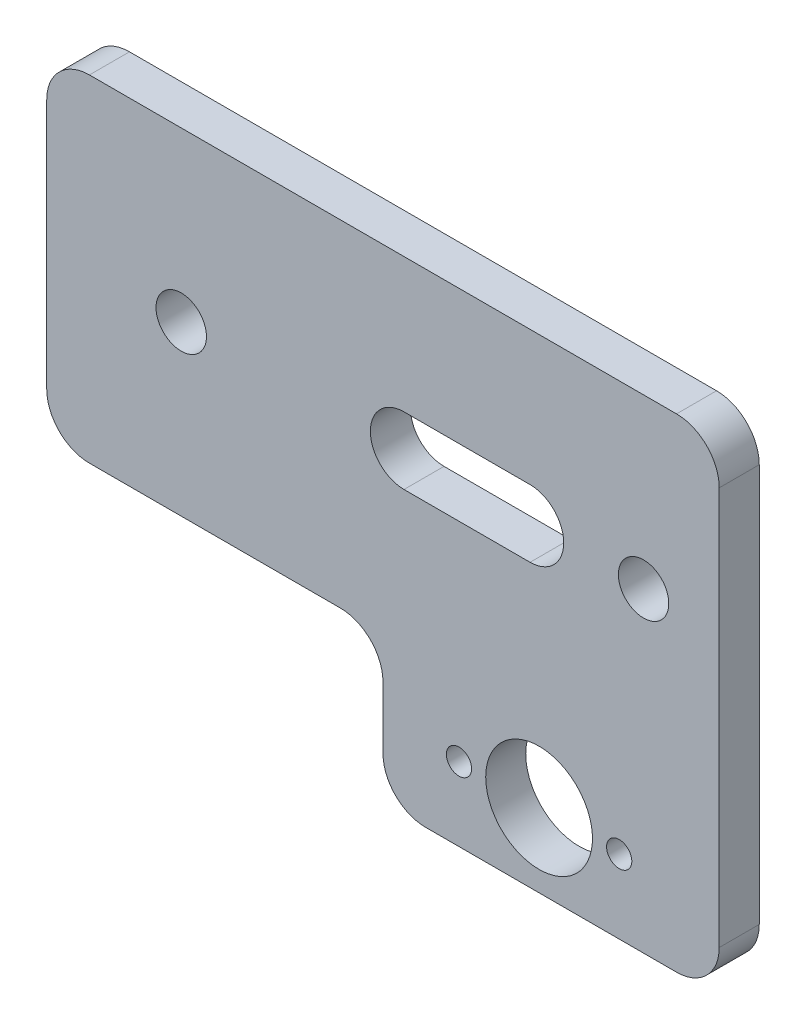
ISO-10303-21;
HEADER;
FILE_DESCRIPTION(('STEP AP214'),'2;1');
FILE_NAME('part.step','',(''),(''),'','','');
FILE_SCHEMA(('AUTOMOTIVE_DESIGN { 1 0 10303 214 1 1 1 1 }'));
ENDSEC;
DATA;
#1=APPLICATION_CONTEXT('core data for automotive mechanical design processes');
#2=APPLICATION_PROTOCOL_DEFINITION('international standard','automotive_design',2000,#1);
#3=PRODUCT_CONTEXT('',#1,'mechanical');
#4=PRODUCT('Part','Part','',(#3));
#5=PRODUCT_RELATED_PRODUCT_CATEGORY('part','',(#4));
#6=PRODUCT_DEFINITION_FORMATION('','',#4);
#7=PRODUCT_DEFINITION_CONTEXT('part definition',#1,'design');
#8=PRODUCT_DEFINITION('design','',#6,#7);
#9=PRODUCT_DEFINITION_SHAPE('','',#8);
#10=(LENGTH_UNIT() NAMED_UNIT(*) SI_UNIT(.MILLI.,.METRE.));
#11=(NAMED_UNIT(*) PLANE_ANGLE_UNIT() SI_UNIT($,.RADIAN.));
#12=(NAMED_UNIT(*) SI_UNIT($,.STERADIAN.) SOLID_ANGLE_UNIT());
#13=UNCERTAINTY_MEASURE_WITH_UNIT(LENGTH_MEASURE(1.E-05),#10,'distance_accuracy_value','');
#14=(GEOMETRIC_REPRESENTATION_CONTEXT(3) GLOBAL_UNCERTAINTY_ASSIGNED_CONTEXT((#13)) GLOBAL_UNIT_ASSIGNED_CONTEXT((#10,
#11,#12)) REPRESENTATION_CONTEXT('',''));
#15=CARTESIAN_POINT('',(0.,0.,0.));
#16=DIRECTION('',(0.,0.,1.));
#17=DIRECTION('',(1.,0.,0.));
#18=AXIS2_PLACEMENT_3D('',#15,#16,#17);
#19=CARTESIAN_POINT('',(0.,0.,4.7625));
#20=DIRECTION('',(0.,0.,-1.));
#21=DIRECTION('',(-1.,0.,0.));
#22=AXIS2_PLACEMENT_3D('',#19,#20,#21);
#23=PLANE('',#22);
#24=CARTESIAN_POINT('',(497.524361343207,-25.943086608279,4.7625));
#25=DIRECTION('',(0.,0.,-1.));
#26=DIRECTION('',(-1.,0.,0.));
#27=AXIS2_PLACEMENT_3D('',#24,#25,#26);
#28=CIRCLE('',#27,1.5);
#29=CARTESIAN_POINT('',(496.024361343207,-25.943086608279,4.7625));
#30=VERTEX_POINT('',#29);
#31=EDGE_CURVE('E507',#30,#30,#28,.T.);
#32=ORIENTED_EDGE('',*,*,#31,.T.);
#33=EDGE_LOOP('',(#32));
#34=FACE_BOUND('',#33,.T.);
#35=CARTESIAN_POINT('',(516.584361343207,-25.943086608279,4.7625));
#36=DIRECTION('',(0.,0.,-1.));
#37=DIRECTION('',(-1.,0.,0.));
#38=AXIS2_PLACEMENT_3D('',#35,#36,#37);
#39=CIRCLE('',#38,1.49999999999995);
#40=CARTESIAN_POINT('',(515.084361343207,-25.943086608279,4.7625));
#41=VERTEX_POINT('',#40);
#42=EDGE_CURVE('E511',#41,#41,#39,.T.);
#43=ORIENTED_EDGE('',*,*,#42,.T.);
#44=EDGE_LOOP('',(#43));
#45=FACE_BOUND('',#44,.T.);
#46=CARTESIAN_POINT('',(464.484361343207,2.81691339172102,4.7625));
#47=DIRECTION('',(0.,0.,1.));
#48=DIRECTION('',(1.,0.,0.));
#49=AXIS2_PLACEMENT_3D('',#46,#47,#48);
#50=CIRCLE('',#49,3.00000000002989);
#51=CARTESIAN_POINT('',(461.484361343177,2.81691339172102,4.7625));
#52=VERTEX_POINT('',#51);
#53=EDGE_CURVE('E180',#52,#52,#50,.T.);
#54=ORIENTED_EDGE('',*,*,#53,.F.);
#55=EDGE_LOOP('',(#54));
#56=FACE_BOUND('',#55,.T.);
#57=CARTESIAN_POINT('',(507.054361343207,-25.943086608279,4.7625));
#58=DIRECTION('',(0.,0.,1.));
#59=DIRECTION('',(1.,0.,0.));
#60=AXIS2_PLACEMENT_3D('',#57,#58,#59);
#61=CIRCLE('',#60,6.34999999918693);
#62=CARTESIAN_POINT('',(500.70436134402,-25.943086608279,4.7625));
#63=VERTEX_POINT('',#62);
#64=EDGE_CURVE('E191',#63,#63,#61,.T.);
#65=ORIENTED_EDGE('',*,*,#64,.F.);
#66=EDGE_LOOP('',(#65));
#67=FACE_BOUND('',#66,.T.);
#68=DIRECTION('',(-1.,0.,0.));
#69=VECTOR('',#68,1.);
#70=CARTESIAN_POINT('',(528.484361343207,22.816913391721,4.7625));
#71=LINE('',#70,#69);
#72=CARTESIAN_POINT('',(523.404361343207,22.816913391721,4.7625));
#73=VERTEX_POINT('',#72);
#74=CARTESIAN_POINT('',(453.564361343207,22.816913391721,4.7625));
#75=VERTEX_POINT('',#74);
#76=EDGE_CURVE('E200',#73,#75,#71,.T.);
#77=ORIENTED_EDGE('',*,*,#76,.T.);
#78=CARTESIAN_POINT('',(453.564361343207,17.736913391721,4.7625));
#79=DIRECTION('',(0.,0.,-1.));
#80=DIRECTION('',(-1.,0.,0.));
#81=AXIS2_PLACEMENT_3D('',#78,#79,#80);
#82=CIRCLE('',#81,5.08);
#83=CARTESIAN_POINT('',(448.484361343207,17.736913391721,4.7625));
#84=VERTEX_POINT('',#83);
#85=EDGE_CURVE('E256',#75,#84,#82,.F.);
#86=ORIENTED_EDGE('',*,*,#85,.T.);
#87=DIRECTION('',(0.,-1.,0.));
#88=VECTOR('',#87,1.);
#89=CARTESIAN_POINT('',(448.484361343207,22.816913391721,4.7625));
#90=LINE('',#89,#88);
#91=CARTESIAN_POINT('',(448.484361343207,-12.103086608279,4.7625));
#92=VERTEX_POINT('',#91);
#93=EDGE_CURVE('E204',#84,#92,#90,.T.);
#94=ORIENTED_EDGE('',*,*,#93,.T.);
#95=CARTESIAN_POINT('',(453.564361343207,-12.103086608279,4.7625));
#96=DIRECTION('',(0.,0.,-1.));
#97=DIRECTION('',(-1.,0.,0.));
#98=AXIS2_PLACEMENT_3D('',#95,#96,#97);
#99=CIRCLE('',#98,5.08);
#100=CARTESIAN_POINT('',(453.564361343207,-17.183086608279,4.7625));
#101=VERTEX_POINT('',#100);
#102=EDGE_CURVE('E254',#92,#101,#99,.F.);
#103=ORIENTED_EDGE('',*,*,#102,.T.);
#104=DIRECTION('',(1.,0.,0.));
#105=VECTOR('',#104,1.);
#106=CARTESIAN_POINT('',(448.484361343207,-17.183086608279,4.7625));
#107=LINE('',#106,#105);
#108=CARTESIAN_POINT('',(483.404361343207,-17.183086608279,4.7625));
#109=VERTEX_POINT('',#108);
#110=EDGE_CURVE('E207',#101,#109,#107,.T.);
#111=ORIENTED_EDGE('',*,*,#110,.T.);
#112=CARTESIAN_POINT('',(483.404361343207,-22.263086608279,4.7625));
#113=DIRECTION('',(0.,0.,-1.));
#114=DIRECTION('',(-1.,0.,0.));
#115=AXIS2_PLACEMENT_3D('',#112,#113,#114);
#116=CIRCLE('',#115,5.08);
#117=CARTESIAN_POINT('',(488.484361343207,-22.263086608279,4.7625));
#118=VERTEX_POINT('',#117);
#119=EDGE_CURVE('E11',#109,#118,#116,.T.);
#120=ORIENTED_EDGE('',*,*,#119,.T.);
#121=DIRECTION('',(0.,-1.,0.));
#122=VECTOR('',#121,1.);
#123=CARTESIAN_POINT('',(488.484361343207,-17.183086608279,4.7625));
#124=LINE('',#123,#122);
#125=CARTESIAN_POINT('',(488.484361343207,-29.623086608279,4.7625));
#126=VERTEX_POINT('',#125);
#127=EDGE_CURVE('E210',#118,#126,#124,.T.);
#128=ORIENTED_EDGE('',*,*,#127,.T.);
#129=CARTESIAN_POINT('',(493.564361343207,-29.623086608279,4.7625));
#130=DIRECTION('',(0.,0.,-1.));
#131=DIRECTION('',(-1.,0.,0.));
#132=AXIS2_PLACEMENT_3D('',#129,#130,#131);
#133=CIRCLE('',#132,5.08);
#134=CARTESIAN_POINT('',(493.564361343207,-34.703086608279,4.7625));
#135=VERTEX_POINT('',#134);
#136=EDGE_CURVE('E54',#126,#135,#133,.F.);
#137=ORIENTED_EDGE('',*,*,#136,.T.);
#138=DIRECTION('',(1.,0.,0.));
#139=VECTOR('',#138,1.);
#140=CARTESIAN_POINT('',(528.484361343207,-34.703086608279,4.7625));
#141=LINE('',#140,#139);
#142=CARTESIAN_POINT('',(523.404361343207,-34.703086608279,4.7625));
#143=VERTEX_POINT('',#142);
#144=EDGE_CURVE('E212',#135,#143,#141,.T.);
#145=ORIENTED_EDGE('',*,*,#144,.T.);
#146=CARTESIAN_POINT('',(523.404361343207,-29.623086608279,4.7625));
#147=DIRECTION('',(0.,0.,-1.));
#148=DIRECTION('',(-1.,0.,0.));
#149=AXIS2_PLACEMENT_3D('',#146,#147,#148);
#150=CIRCLE('',#149,5.08);
#151=CARTESIAN_POINT('',(528.484361343207,-29.623086608279,4.7625));
#152=VERTEX_POINT('',#151);
#153=EDGE_CURVE('E249',#143,#152,#150,.F.);
#154=ORIENTED_EDGE('',*,*,#153,.T.);
#155=DIRECTION('',(0.,1.,0.));
#156=VECTOR('',#155,1.);
#157=CARTESIAN_POINT('',(528.484361343207,22.816913391721,4.7625));
#158=LINE('',#157,#156);
#159=CARTESIAN_POINT('',(528.484361343207,17.736913391721,4.7625));
#160=VERTEX_POINT('',#159);
#161=EDGE_CURVE('E197',#152,#160,#158,.T.);
#162=ORIENTED_EDGE('',*,*,#161,.T.);
#163=CARTESIAN_POINT('',(523.404361343207,17.736913391721,4.7625));
#164=DIRECTION('',(0.,0.,-1.));
#165=DIRECTION('',(-1.,0.,0.));
#166=AXIS2_PLACEMENT_3D('',#163,#164,#165);
#167=CIRCLE('',#166,5.08);
#168=EDGE_CURVE('E252',#160,#73,#167,.F.);
#169=ORIENTED_EDGE('',*,*,#168,.T.);
#170=EDGE_LOOP('',(#77,#86,#94,#103,#111,#120,#128,#137,#145,#154,#162,#169));
#171=FACE_BOUND('',#170,.T.);
#172=CARTESIAN_POINT('',(490.984361343207,2.81691339172103,4.7625));
#173=DIRECTION('',(0.,0.,1.));
#174=DIRECTION('',(1.,0.,0.));
#175=AXIS2_PLACEMENT_3D('',#172,#173,#174);
#176=CIRCLE('',#175,4.);
#177=CARTESIAN_POINT('',(490.984361343207,6.81691339172103,4.7625));
#178=VERTEX_POINT('',#177);
#179=CARTESIAN_POINT('',(490.984361343207,-1.18308660827897,4.7625));
#180=VERTEX_POINT('',#179);
#181=EDGE_CURVE('E147',#178,#180,#176,.T.);
#182=ORIENTED_EDGE('',*,*,#181,.F.);
#183=DIRECTION('',(-1.,0.,0.));
#184=VECTOR('',#183,1.);
#185=CARTESIAN_POINT('',(490.984361343207,6.81691339172103,4.7625));
#186=LINE('',#185,#184);
#187=CARTESIAN_POINT('',(505.984361343207,6.81691339172103,4.7625));
#188=VERTEX_POINT('',#187);
#189=EDGE_CURVE('E173',#188,#178,#186,.T.);
#190=ORIENTED_EDGE('',*,*,#189,.F.);
#191=CARTESIAN_POINT('',(505.984361343207,2.81691339172103,4.7625));
#192=DIRECTION('',(0.,0.,1.));
#193=DIRECTION('',(1.,0.,0.));
#194=AXIS2_PLACEMENT_3D('',#191,#192,#193);
#195=CIRCLE('',#194,4.);
#196=CARTESIAN_POINT('',(505.984361343207,-1.18308660827897,4.7625));
#197=VERTEX_POINT('',#196);
#198=EDGE_CURVE('E171',#197,#188,#195,.T.);
#199=ORIENTED_EDGE('',*,*,#198,.F.);
#200=DIRECTION('',(1.,0.,0.));
#201=VECTOR('',#200,1.);
#202=CARTESIAN_POINT('',(490.984361343207,-1.18308660827897,4.7625));
#203=LINE('',#202,#201);
#204=EDGE_CURVE('E157',#180,#197,#203,.T.);
#205=ORIENTED_EDGE('',*,*,#204,.F.);
#206=EDGE_LOOP('',(#182,#190,#199,#205));
#207=FACE_BOUND('',#206,.T.);
#208=CARTESIAN_POINT('',(519.484361343207,2.81691339172103,4.7625));
#209=DIRECTION('',(0.,0.,1.));
#210=DIRECTION('',(1.,0.,0.));
#211=AXIS2_PLACEMENT_3D('',#208,#209,#210);
#212=CIRCLE('',#211,3.00000000003267);
#213=CARTESIAN_POINT('',(516.484361343174,2.81691339172103,4.7625));
#214=VERTEX_POINT('',#213);
#215=EDGE_CURVE('E518',#214,#214,#212,.T.);
#216=ORIENTED_EDGE('',*,*,#215,.F.);
#217=EDGE_LOOP('',(#216));
#218=FACE_BOUND('',#217,.T.);
#219=ADVANCED_FACE('F32',(#34,#45,#56,#67,#171,#207,#218),#23,.F.);
#220=CARTESIAN_POINT('',(0.,0.,0.));
#221=DIRECTION('',(0.,0.,-1.));
#222=DIRECTION('',(-1.,0.,0.));
#223=AXIS2_PLACEMENT_3D('',#220,#221,#222);
#224=PLANE('',#223);
#225=CARTESIAN_POINT('',(497.524361343207,-25.943086608279,0.));
#226=DIRECTION('',(0.,0.,-1.));
#227=DIRECTION('',(-1.,0.,0.));
#228=AXIS2_PLACEMENT_3D('',#225,#226,#227);
#229=CIRCLE('',#228,1.5);
#230=CARTESIAN_POINT('',(496.024361343207,-25.943086608279,0.));
#231=VERTEX_POINT('',#230);
#232=EDGE_CURVE('E505',#231,#231,#229,.T.);
#233=ORIENTED_EDGE('',*,*,#232,.F.);
#234=EDGE_LOOP('',(#233));
#235=FACE_BOUND('',#234,.T.);
#236=CARTESIAN_POINT('',(516.584361343207,-25.943086608279,0.));
#237=DIRECTION('',(0.,0.,-1.));
#238=DIRECTION('',(-1.,0.,0.));
#239=AXIS2_PLACEMENT_3D('',#236,#237,#238);
#240=CIRCLE('',#239,1.49999999999995);
#241=CARTESIAN_POINT('',(515.084361343207,-25.943086608279,0.));
#242=VERTEX_POINT('',#241);
#243=EDGE_CURVE('E508',#242,#242,#240,.T.);
#244=ORIENTED_EDGE('',*,*,#243,.F.);
#245=EDGE_LOOP('',(#244));
#246=FACE_BOUND('',#245,.T.);
#247=CARTESIAN_POINT('',(464.484361343207,2.81691339172102,0.));
#248=DIRECTION('',(0.,0.,1.));
#249=DIRECTION('',(1.,0.,0.));
#250=AXIS2_PLACEMENT_3D('',#247,#248,#249);
#251=CIRCLE('',#250,3.00000000002989);
#252=CARTESIAN_POINT('',(461.484361343177,2.81691339172102,0.));
#253=VERTEX_POINT('',#252);
#254=EDGE_CURVE('E521',#253,#253,#251,.T.);
#255=ORIENTED_EDGE('',*,*,#254,.T.);
#256=EDGE_LOOP('',(#255));
#257=FACE_BOUND('',#256,.T.);
#258=CARTESIAN_POINT('',(507.054361343207,-25.943086608279,0.));
#259=DIRECTION('',(0.,0.,1.));
#260=DIRECTION('',(1.,0.,0.));
#261=AXIS2_PLACEMENT_3D('',#258,#259,#260);
#262=CIRCLE('',#261,6.34999999918693);
#263=CARTESIAN_POINT('',(500.70436134402,-25.943086608279,0.));
#264=VERTEX_POINT('',#263);
#265=EDGE_CURVE('E165',#264,#264,#262,.T.);
#266=ORIENTED_EDGE('',*,*,#265,.T.);
#267=EDGE_LOOP('',(#266));
#268=FACE_BOUND('',#267,.T.);
#269=DIRECTION('',(0.,-1.,0.));
#270=VECTOR('',#269,1.);
#271=CARTESIAN_POINT('',(448.484361343207,22.816913391721,0.));
#272=LINE('',#271,#270);
#273=CARTESIAN_POINT('',(448.484361343207,17.736913391721,0.));
#274=VERTEX_POINT('',#273);
#275=CARTESIAN_POINT('',(448.484361343207,-12.103086608279,0.));
#276=VERTEX_POINT('',#275);
#277=EDGE_CURVE('E220',#274,#276,#272,.T.);
#278=ORIENTED_EDGE('',*,*,#277,.F.);
#279=CARTESIAN_POINT('',(453.564361343207,17.736913391721,0.));
#280=DIRECTION('',(0.,0.,-1.));
#281=DIRECTION('',(-1.,0.,0.));
#282=AXIS2_PLACEMENT_3D('',#279,#280,#281);
#283=CIRCLE('',#282,5.08);
#284=CARTESIAN_POINT('',(453.564361343207,22.816913391721,0.));
#285=VERTEX_POINT('',#284);
#286=EDGE_CURVE('E242',#274,#285,#283,.T.);
#287=ORIENTED_EDGE('',*,*,#286,.T.);
#288=DIRECTION('',(-1.,0.,0.));
#289=VECTOR('',#288,1.);
#290=CARTESIAN_POINT('',(528.484361343207,22.816913391721,0.));
#291=LINE('',#290,#289);
#292=CARTESIAN_POINT('',(523.404361343207,22.816913391721,0.));
#293=VERTEX_POINT('',#292);
#294=EDGE_CURVE('E217',#293,#285,#291,.T.);
#295=ORIENTED_EDGE('',*,*,#294,.F.);
#296=CARTESIAN_POINT('',(523.404361343207,17.736913391721,0.));
#297=DIRECTION('',(0.,0.,-1.));
#298=DIRECTION('',(-1.,0.,0.));
#299=AXIS2_PLACEMENT_3D('',#296,#297,#298);
#300=CIRCLE('',#299,5.08);
#301=CARTESIAN_POINT('',(528.484361343207,17.736913391721,0.));
#302=VERTEX_POINT('',#301);
#303=EDGE_CURVE('E238',#293,#302,#300,.T.);
#304=ORIENTED_EDGE('',*,*,#303,.T.);
#305=DIRECTION('',(0.,1.,0.));
#306=VECTOR('',#305,1.);
#307=CARTESIAN_POINT('',(528.484361343207,22.816913391721,0.));
#308=LINE('',#307,#306);
#309=CARTESIAN_POINT('',(528.484361343207,-29.623086608279,0.));
#310=VERTEX_POINT('',#309);
#311=EDGE_CURVE('E194',#310,#302,#308,.T.);
#312=ORIENTED_EDGE('',*,*,#311,.F.);
#313=CARTESIAN_POINT('',(523.404361343207,-29.623086608279,0.));
#314=DIRECTION('',(0.,0.,-1.));
#315=DIRECTION('',(-1.,0.,0.));
#316=AXIS2_PLACEMENT_3D('',#313,#314,#315);
#317=CIRCLE('',#316,5.08);
#318=CARTESIAN_POINT('',(523.404361343207,-34.703086608279,0.));
#319=VERTEX_POINT('',#318);
#320=EDGE_CURVE('E234',#310,#319,#317,.T.);
#321=ORIENTED_EDGE('',*,*,#320,.T.);
#322=DIRECTION('',(1.,0.,0.));
#323=VECTOR('',#322,1.);
#324=CARTESIAN_POINT('',(528.484361343207,-34.703086608279,0.));
#325=LINE('',#324,#323);
#326=CARTESIAN_POINT('',(493.564361343207,-34.703086608279,0.));
#327=VERTEX_POINT('',#326);
#328=EDGE_CURVE('E201',#327,#319,#325,.T.);
#329=ORIENTED_EDGE('',*,*,#328,.F.);
#330=CARTESIAN_POINT('',(493.564361343207,-29.623086608279,0.));
#331=DIRECTION('',(0.,0.,-1.));
#332=DIRECTION('',(-1.,0.,0.));
#333=AXIS2_PLACEMENT_3D('',#330,#331,#332);
#334=CIRCLE('',#333,5.08);
#335=CARTESIAN_POINT('',(488.484361343207,-29.623086608279,0.));
#336=VERTEX_POINT('',#335);
#337=EDGE_CURVE('E236',#327,#336,#334,.T.);
#338=ORIENTED_EDGE('',*,*,#337,.T.);
#339=DIRECTION('',(0.,-1.,0.));
#340=VECTOR('',#339,1.);
#341=CARTESIAN_POINT('',(488.484361343207,-17.183086608279,0.));
#342=LINE('',#341,#340);
#343=CARTESIAN_POINT('',(488.484361343207,-22.263086608279,0.));
#344=VERTEX_POINT('',#343);
#345=EDGE_CURVE('E226',#344,#336,#342,.T.);
#346=ORIENTED_EDGE('',*,*,#345,.F.);
#347=CARTESIAN_POINT('',(483.404361343207,-22.263086608279,0.));
#348=DIRECTION('',(0.,0.,-1.));
#349=DIRECTION('',(-1.,0.,0.));
#350=AXIS2_PLACEMENT_3D('',#347,#348,#349);
#351=CIRCLE('',#350,5.08);
#352=CARTESIAN_POINT('',(483.404361343207,-17.183086608279,0.));
#353=VERTEX_POINT('',#352);
#354=EDGE_CURVE('E40',#344,#353,#351,.F.);
#355=ORIENTED_EDGE('',*,*,#354,.T.);
#356=DIRECTION('',(1.,0.,0.));
#357=VECTOR('',#356,1.);
#358=CARTESIAN_POINT('',(448.484361343207,-17.183086608279,0.));
#359=LINE('',#358,#357);
#360=CARTESIAN_POINT('',(453.564361343207,-17.183086608279,0.));
#361=VERTEX_POINT('',#360);
#362=EDGE_CURVE('E223',#361,#353,#359,.T.);
#363=ORIENTED_EDGE('',*,*,#362,.F.);
#364=CARTESIAN_POINT('',(453.564361343207,-12.103086608279,0.));
#365=DIRECTION('',(0.,0.,-1.));
#366=DIRECTION('',(-1.,0.,0.));
#367=AXIS2_PLACEMENT_3D('',#364,#365,#366);
#368=CIRCLE('',#367,5.08);
#369=EDGE_CURVE('E240',#361,#276,#368,.T.);
#370=ORIENTED_EDGE('',*,*,#369,.T.);
#371=EDGE_LOOP('',(#278,#287,#295,#304,#312,#321,#329,#338,#346,#355,#363,#370));
#372=FACE_BOUND('',#371,.T.);
#373=DIRECTION('',(-1.,0.,0.));
#374=VECTOR('',#373,1.);
#375=CARTESIAN_POINT('',(490.984361343207,6.81691339172103,0.));
#376=LINE('',#375,#374);
#377=CARTESIAN_POINT('',(505.984361343207,6.81691339172103,0.));
#378=VERTEX_POINT('',#377);
#379=CARTESIAN_POINT('',(490.984361343207,6.81691339172103,0.));
#380=VERTEX_POINT('',#379);
#381=EDGE_CURVE('E158',#378,#380,#376,.T.);
#382=ORIENTED_EDGE('',*,*,#381,.T.);
#383=CARTESIAN_POINT('',(490.984361343207,2.81691339172103,0.));
#384=DIRECTION('',(0.,0.,1.));
#385=DIRECTION('',(1.,0.,0.));
#386=AXIS2_PLACEMENT_3D('',#383,#384,#385);
#387=CIRCLE('',#386,4.);
#388=CARTESIAN_POINT('',(490.984361343207,-1.18308660827897,0.));
#389=VERTEX_POINT('',#388);
#390=EDGE_CURVE('E178',#380,#389,#387,.T.);
#391=ORIENTED_EDGE('',*,*,#390,.T.);
#392=DIRECTION('',(1.,0.,0.));
#393=VECTOR('',#392,1.);
#394=CARTESIAN_POINT('',(490.984361343207,-1.18308660827897,0.));
#395=LINE('',#394,#393);
#396=CARTESIAN_POINT('',(505.984361343207,-1.18308660827897,0.));
#397=VERTEX_POINT('',#396);
#398=EDGE_CURVE('E164',#389,#397,#395,.T.);
#399=ORIENTED_EDGE('',*,*,#398,.T.);
#400=CARTESIAN_POINT('',(505.984361343207,2.81691339172103,0.));
#401=DIRECTION('',(0.,0.,1.));
#402=DIRECTION('',(1.,0.,0.));
#403=AXIS2_PLACEMENT_3D('',#400,#401,#402);
#404=CIRCLE('',#403,4.);
#405=EDGE_CURVE('E182',#397,#378,#404,.T.);
#406=ORIENTED_EDGE('',*,*,#405,.T.);
#407=EDGE_LOOP('',(#382,#391,#399,#406));
#408=FACE_BOUND('',#407,.T.);
#409=CARTESIAN_POINT('',(519.484361343207,2.81691339172103,0.));
#410=DIRECTION('',(0.,0.,1.));
#411=DIRECTION('',(1.,0.,0.));
#412=AXIS2_PLACEMENT_3D('',#409,#410,#411);
#413=CIRCLE('',#412,3.00000000003267);
#414=CARTESIAN_POINT('',(516.484361343174,2.81691339172103,0.));
#415=VERTEX_POINT('',#414);
#416=EDGE_CURVE('E517',#415,#415,#413,.T.);
#417=ORIENTED_EDGE('',*,*,#416,.T.);
#418=EDGE_LOOP('',(#417));
#419=FACE_BOUND('',#418,.T.);
#420=ADVANCED_FACE('F280',(#235,#246,#257,#268,#372,#408,#419),#224,.T.);
#421=CARTESIAN_POINT('',(528.484361343207,22.816913391721,4.7625));
#422=DIRECTION('',(-1.,0.,0.));
#423=DIRECTION('',(0.,0.,1.));
#424=AXIS2_PLACEMENT_3D('',#421,#422,#423);
#425=PLANE('',#424);
#426=ORIENTED_EDGE('',*,*,#311,.T.);
#427=DIRECTION('',(0.,0.,-1.));
#428=VECTOR('',#427,1.);
#429=CARTESIAN_POINT('',(528.484361343207,17.736913391721,4.7625));
#430=LINE('',#429,#428);
#431=EDGE_CURVE('E271',#302,#160,#430,.F.);
#432=ORIENTED_EDGE('',*,*,#431,.T.);
#433=ORIENTED_EDGE('',*,*,#161,.F.);
#434=DIRECTION('',(0.,0.,-1.));
#435=VECTOR('',#434,1.);
#436=CARTESIAN_POINT('',(528.484361343207,-29.623086608279,4.7625));
#437=LINE('',#436,#435);
#438=EDGE_CURVE('E268',#152,#310,#437,.T.);
#439=ORIENTED_EDGE('',*,*,#438,.T.);
#440=EDGE_LOOP('',(#426,#432,#433,#439));
#441=FACE_BOUND('',#440,.T.);
#442=ADVANCED_FACE('F306',(#441),#425,.F.);
#443=CARTESIAN_POINT('',(528.484361343207,22.816913391721,4.7625));
#444=DIRECTION('',(0.,-1.,0.));
#445=DIRECTION('',(1.,0.,0.));
#446=AXIS2_PLACEMENT_3D('',#443,#444,#445);
#447=PLANE('',#446);
#448=ORIENTED_EDGE('',*,*,#294,.T.);
#449=DIRECTION('',(0.,0.,-1.));
#450=VECTOR('',#449,1.);
#451=CARTESIAN_POINT('',(453.564361343207,22.816913391721,4.7625));
#452=LINE('',#451,#450);
#453=EDGE_CURVE('E247',#285,#75,#452,.F.);
#454=ORIENTED_EDGE('',*,*,#453,.T.);
#455=ORIENTED_EDGE('',*,*,#76,.F.);
#456=DIRECTION('',(0.,0.,-1.));
#457=VECTOR('',#456,1.);
#458=CARTESIAN_POINT('',(523.404361343207,22.816913391721,4.7625));
#459=LINE('',#458,#457);
#460=EDGE_CURVE('E244',#73,#293,#459,.T.);
#461=ORIENTED_EDGE('',*,*,#460,.T.);
#462=EDGE_LOOP('',(#448,#454,#455,#461));
#463=FACE_BOUND('',#462,.T.);
#464=ADVANCED_FACE('F315',(#463),#447,.F.);
#465=CARTESIAN_POINT('',(448.484361343207,22.816913391721,4.7625));
#466=DIRECTION('',(1.,0.,0.));
#467=DIRECTION('',(0.,1.,0.));
#468=AXIS2_PLACEMENT_3D('',#465,#466,#467);
#469=PLANE('',#468);
#470=ORIENTED_EDGE('',*,*,#93,.F.);
#471=DIRECTION('',(0.,0.,-1.));
#472=VECTOR('',#471,1.);
#473=CARTESIAN_POINT('',(448.484361343207,17.736913391721,4.7625));
#474=LINE('',#473,#472);
#475=EDGE_CURVE('E231',#84,#274,#474,.T.);
#476=ORIENTED_EDGE('',*,*,#475,.T.);
#477=ORIENTED_EDGE('',*,*,#277,.T.);
#478=DIRECTION('',(0.,0.,-1.));
#479=VECTOR('',#478,1.);
#480=CARTESIAN_POINT('',(448.484361343207,-12.103086608279,4.7625));
#481=LINE('',#480,#479);
#482=EDGE_CURVE('E214',#276,#92,#481,.F.);
#483=ORIENTED_EDGE('',*,*,#482,.T.);
#484=EDGE_LOOP('',(#470,#476,#477,#483));
#485=FACE_BOUND('',#484,.T.);
#486=ADVANCED_FACE('F323',(#485),#469,.F.);
#487=CARTESIAN_POINT('',(448.484361343207,-17.183086608279,4.7625));
#488=DIRECTION('',(0.,1.,0.));
#489=DIRECTION('',(-1.,0.,0.));
#490=AXIS2_PLACEMENT_3D('',#487,#488,#489);
#491=PLANE('',#490);
#492=ORIENTED_EDGE('',*,*,#110,.F.);
#493=DIRECTION('',(0.,0.,-1.));
#494=VECTOR('',#493,1.);
#495=CARTESIAN_POINT('',(453.564361343207,-17.183086608279,4.7625));
#496=LINE('',#495,#494);
#497=EDGE_CURVE('E260',#101,#361,#496,.T.);
#498=ORIENTED_EDGE('',*,*,#497,.T.);
#499=ORIENTED_EDGE('',*,*,#362,.T.);
#500=DIRECTION('',(0.,0.,-1.));
#501=VECTOR('',#500,1.);
#502=CARTESIAN_POINT('',(483.404361343207,-17.183086608279,4.7625));
#503=LINE('',#502,#501);
#504=EDGE_CURVE('E258',#353,#109,#503,.F.);
#505=ORIENTED_EDGE('',*,*,#504,.T.);
#506=EDGE_LOOP('',(#492,#498,#499,#505));
#507=FACE_BOUND('',#506,.T.);
#508=ADVANCED_FACE('F287',(#507),#491,.F.);
#509=CARTESIAN_POINT('',(488.484361343207,-17.183086608279,4.7625));
#510=DIRECTION('',(1.,0.,0.));
#511=DIRECTION('',(0.,0.,-1.));
#512=AXIS2_PLACEMENT_3D('',#509,#510,#511);
#513=PLANE('',#512);
#514=ORIENTED_EDGE('',*,*,#127,.F.);
#515=DIRECTION('',(0.,0.,-1.));
#516=VECTOR('',#515,1.);
#517=CARTESIAN_POINT('',(488.484361343207,-22.263086608279,0.));
#518=LINE('',#517,#516);
#519=EDGE_CURVE('E265',#118,#344,#518,.T.);
#520=ORIENTED_EDGE('',*,*,#519,.T.);
#521=ORIENTED_EDGE('',*,*,#345,.T.);
#522=DIRECTION('',(0.,0.,-1.));
#523=VECTOR('',#522,1.);
#524=CARTESIAN_POINT('',(488.484361343207,-29.623086608279,4.7625));
#525=LINE('',#524,#523);
#526=EDGE_CURVE('E263',#336,#126,#525,.F.);
#527=ORIENTED_EDGE('',*,*,#526,.T.);
#528=EDGE_LOOP('',(#514,#520,#521,#527));
#529=FACE_BOUND('',#528,.T.);
#530=ADVANCED_FACE('F293',(#529),#513,.F.);
#531=CARTESIAN_POINT('',(528.484361343207,-34.703086608279,4.7625));
#532=DIRECTION('',(0.,1.,0.));
#533=DIRECTION('',(-1.,0.,0.));
#534=AXIS2_PLACEMENT_3D('',#531,#532,#533);
#535=PLANE('',#534);
#536=ORIENTED_EDGE('',*,*,#144,.F.);
#537=DIRECTION('',(0.,0.,-1.));
#538=VECTOR('',#537,1.);
#539=CARTESIAN_POINT('',(493.564361343207,-34.703086608279,4.7625));
#540=LINE('',#539,#538);
#541=EDGE_CURVE('E274',#135,#327,#540,.T.);
#542=ORIENTED_EDGE('',*,*,#541,.T.);
#543=ORIENTED_EDGE('',*,*,#328,.T.);
#544=DIRECTION('',(0.,0.,-1.));
#545=VECTOR('',#544,1.);
#546=CARTESIAN_POINT('',(523.404361343207,-34.703086608279,4.7625));
#547=LINE('',#546,#545);
#548=EDGE_CURVE('E47',#319,#143,#547,.F.);
#549=ORIENTED_EDGE('',*,*,#548,.T.);
#550=EDGE_LOOP('',(#536,#542,#543,#549));
#551=FACE_BOUND('',#550,.T.);
#552=ADVANCED_FACE('F299',(#551),#535,.F.);
#553=CARTESIAN_POINT('',(507.054361343207,-25.943086608279,4.7625));
#554=DIRECTION('',(0.,0.,-1.));
#555=DIRECTION('',(-1.,0.,0.));
#556=AXIS2_PLACEMENT_3D('',#553,#554,#555);
#557=CYLINDRICAL_SURFACE('',#556,6.34999999918693);
#558=CARTESIAN_POINT('',(500.70436134402,-25.943086608279,4.7625));
#559=CARTESIAN_POINT('',(500.70436134402,-25.943086608279,4.712890625));
#560=CARTESIAN_POINT('',(500.70436134402,-25.943086608279,4.66328125));
#561=CARTESIAN_POINT('',(500.70436134402,-25.943086608279,4.5640625));
#562=CARTESIAN_POINT('',(500.70436134402,-25.943086608279,4.514453125));
#563=CARTESIAN_POINT('',(500.70436134402,-25.943086608279,4.415234375));
#564=CARTESIAN_POINT('',(500.70436134402,-25.943086608279,4.365625));
#565=CARTESIAN_POINT('',(500.70436134402,-25.943086608279,4.26640625));
#566=CARTESIAN_POINT('',(500.70436134402,-25.943086608279,4.216796875));
#567=CARTESIAN_POINT('',(500.70436134402,-25.943086608279,4.117578125));
#568=CARTESIAN_POINT('',(500.70436134402,-25.943086608279,4.06796875));
#569=CARTESIAN_POINT('',(500.70436134402,-25.943086608279,3.96875));
#570=CARTESIAN_POINT('',(500.70436134402,-25.943086608279,3.919140625));
#571=CARTESIAN_POINT('',(500.70436134402,-25.943086608279,3.819921875));
#572=CARTESIAN_POINT('',(500.70436134402,-25.943086608279,3.7703125));
#573=CARTESIAN_POINT('',(500.70436134402,-25.943086608279,3.67109375));
#574=CARTESIAN_POINT('',(500.70436134402,-25.943086608279,3.621484375));
#575=CARTESIAN_POINT('',(500.70436134402,-25.943086608279,3.522265625));
#576=CARTESIAN_POINT('',(500.70436134402,-25.943086608279,3.47265625));
#577=CARTESIAN_POINT('',(500.70436134402,-25.943086608279,3.3734375));
#578=CARTESIAN_POINT('',(500.70436134402,-25.943086608279,3.323828125));
#579=CARTESIAN_POINT('',(500.70436134402,-25.943086608279,3.224609375));
#580=CARTESIAN_POINT('',(500.70436134402,-25.943086608279,3.175));
#581=CARTESIAN_POINT('',(500.70436134402,-25.943086608279,3.07578125));
#582=CARTESIAN_POINT('',(500.70436134402,-25.943086608279,3.026171875));
#583=CARTESIAN_POINT('',(500.70436134402,-25.943086608279,2.926953125));
#584=CARTESIAN_POINT('',(500.70436134402,-25.943086608279,2.87734375));
#585=CARTESIAN_POINT('',(500.70436134402,-25.943086608279,2.778125));
#586=CARTESIAN_POINT('',(500.70436134402,-25.943086608279,2.728515625));
#587=CARTESIAN_POINT('',(500.70436134402,-25.943086608279,2.629296875));
#588=CARTESIAN_POINT('',(500.70436134402,-25.943086608279,2.5796875));
#589=CARTESIAN_POINT('',(500.70436134402,-25.943086608279,2.48046875));
#590=CARTESIAN_POINT('',(500.70436134402,-25.943086608279,2.430859375));
#591=CARTESIAN_POINT('',(500.70436134402,-25.943086608279,2.331640625));
#592=CARTESIAN_POINT('',(500.70436134402,-25.943086608279,2.28203125));
#593=CARTESIAN_POINT('',(500.70436134402,-25.943086608279,2.1828125));
#594=CARTESIAN_POINT('',(500.70436134402,-25.943086608279,2.133203125));
#595=CARTESIAN_POINT('',(500.70436134402,-25.943086608279,2.033984375));
#596=CARTESIAN_POINT('',(500.70436134402,-25.943086608279,1.984375));
#597=CARTESIAN_POINT('',(500.70436134402,-25.943086608279,1.88515625));
#598=CARTESIAN_POINT('',(500.70436134402,-25.943086608279,1.835546875));
#599=CARTESIAN_POINT('',(500.70436134402,-25.943086608279,1.736328125));
#600=CARTESIAN_POINT('',(500.70436134402,-25.943086608279,1.68671875));
#601=CARTESIAN_POINT('',(500.70436134402,-25.943086608279,1.5875));
#602=CARTESIAN_POINT('',(500.70436134402,-25.943086608279,1.537890625));
#603=CARTESIAN_POINT('',(500.70436134402,-25.943086608279,1.438671875));
#604=CARTESIAN_POINT('',(500.70436134402,-25.943086608279,1.3890625));
#605=CARTESIAN_POINT('',(500.70436134402,-25.943086608279,1.28984375));
#606=CARTESIAN_POINT('',(500.70436134402,-25.943086608279,1.240234375));
#607=CARTESIAN_POINT('',(500.70436134402,-25.943086608279,1.141015625));
#608=CARTESIAN_POINT('',(500.70436134402,-25.943086608279,1.09140625));
#609=CARTESIAN_POINT('',(500.70436134402,-25.943086608279,0.992187499999999));
#610=CARTESIAN_POINT('',(500.70436134402,-25.943086608279,0.942578124999999));
#611=CARTESIAN_POINT('',(500.70436134402,-25.943086608279,0.843359375));
#612=CARTESIAN_POINT('',(500.70436134402,-25.943086608279,0.79375));
#613=CARTESIAN_POINT('',(500.70436134402,-25.943086608279,0.69453125));
#614=CARTESIAN_POINT('',(500.70436134402,-25.943086608279,0.644921875));
#615=CARTESIAN_POINT('',(500.70436134402,-25.943086608279,0.545703125));
#616=CARTESIAN_POINT('',(500.70436134402,-25.943086608279,0.49609375));
#617=CARTESIAN_POINT('',(500.70436134402,-25.943086608279,0.396875));
#618=CARTESIAN_POINT('',(500.70436134402,-25.943086608279,0.347265625));
#619=CARTESIAN_POINT('',(500.70436134402,-25.943086608279,0.248046875));
#620=CARTESIAN_POINT('',(500.70436134402,-25.943086608279,0.1984375));
#621=CARTESIAN_POINT('',(500.70436134402,-25.943086608279,0.09921875));
#622=CARTESIAN_POINT('',(500.70436134402,-25.943086608279,0.049609375));
#623=CARTESIAN_POINT('',(500.70436134402,-25.943086608279,0.));
#624=B_SPLINE_CURVE_WITH_KNOTS('',3,(#558,#559,#560,#561,#562,#563,#564,#565,#566,#567,#568,
#569,#570,#571,#572,#573,#574,#575,#576,#577,#578,#579,#580,#581,#582,#583,#584,#585,#586,#587,
#588,#589,#590,#591,#592,#593,#594,#595,#596,#597,#598,#599,#600,#601,#602,#603,#604,#605,#606,
#607,#608,#609,#610,#611,#612,#613,#614,#615,#616,#617,#618,#619,#620,#621,#622,#623),
.UNSPECIFIED.,.F.,.F.,(4,2,2,2,2,2,2,2,2,2,2,2,2,2,2,2,2,2,2,2,2,2,2,2,2,2,2,2,2,2,2,2,4),(0.,
0.148828125,0.29765625,0.446484375,0.5953125,0.744140625,0.892968750000001,1.041796875,1.190625,
1.339453125,1.48828125,1.637109375,1.7859375,1.934765625,2.08359375,2.232421875,2.38125,
2.530078125,2.67890625,2.827734375,2.9765625,3.125390625,3.27421875,3.423046875,3.571875,
3.720703125,3.86953125,4.018359375,4.1671875,4.316015625,4.46484375,4.613671875,4.7625),.UNSPECIFIED.);
#625=EDGE_CURVE('BSEAM348',#63,#264,#624,.T.);
#626=ORIENTED_EDGE('',*,*,#64,.T.);
#627=ORIENTED_EDGE('',*,*,#265,.F.);
#628=ORIENTED_EDGE('',*,*,#625,.T.);
#629=ORIENTED_EDGE('',*,*,#625,.F.);
#630=EDGE_LOOP('',(#626,#628,#627,#629));
#631=FACE_BOUND('',#630,.T.);
#632=ADVANCED_FACE('F348',(#631),#557,.F.);
#633=CARTESIAN_POINT('',(490.984361343207,2.81691339172103,4.7625));
#634=DIRECTION('',(0.,0.,-1.));
#635=DIRECTION('',(-1.,0.,0.));
#636=AXIS2_PLACEMENT_3D('',#633,#634,#635);
#637=CYLINDRICAL_SURFACE('',#636,4.);
#638=ORIENTED_EDGE('',*,*,#390,.F.);
#639=DIRECTION('',(0.,0.,-1.));
#640=VECTOR('',#639,1.);
#641=CARTESIAN_POINT('',(490.984361343207,6.81691339172103,4.7625));
#642=LINE('',#641,#640);
#643=EDGE_CURVE('E153',#178,#380,#642,.T.);
#644=ORIENTED_EDGE('',*,*,#643,.F.);
#645=ORIENTED_EDGE('',*,*,#181,.T.);
#646=DIRECTION('',(0.,0.,-1.));
#647=VECTOR('',#646,1.);
#648=CARTESIAN_POINT('',(490.984361343207,-1.18308660827897,4.7625));
#649=LINE('',#648,#647);
#650=EDGE_CURVE('E150',#180,#389,#649,.T.);
#651=ORIENTED_EDGE('',*,*,#650,.T.);
#652=EDGE_LOOP('',(#638,#644,#645,#651));
#653=FACE_BOUND('',#652,.T.);
#654=ADVANCED_FACE('F149',(#653),#637,.F.);
#655=CARTESIAN_POINT('',(490.984361343207,-1.18308660827897,4.7625));
#656=DIRECTION('',(0.,1.,0.));
#657=DIRECTION('',(-1.,0.,0.));
#658=AXIS2_PLACEMENT_3D('',#655,#656,#657);
#659=PLANE('',#658);
#660=ORIENTED_EDGE('',*,*,#398,.F.);
#661=ORIENTED_EDGE('',*,*,#650,.F.);
#662=ORIENTED_EDGE('',*,*,#204,.T.);
#663=DIRECTION('',(0.,0.,-1.));
#664=VECTOR('',#663,1.);
#665=CARTESIAN_POINT('',(505.984361343207,-1.18308660827897,4.7625));
#666=LINE('',#665,#664);
#667=EDGE_CURVE('E166',#197,#397,#666,.T.);
#668=ORIENTED_EDGE('',*,*,#667,.T.);
#669=EDGE_LOOP('',(#660,#661,#662,#668));
#670=FACE_BOUND('',#669,.T.);
#671=ADVANCED_FACE('F161',(#670),#659,.T.);
#672=CARTESIAN_POINT('',(505.984361343207,2.81691339172103,4.7625));
#673=DIRECTION('',(0.,0.,-1.));
#674=DIRECTION('',(-1.,0.,0.));
#675=AXIS2_PLACEMENT_3D('',#672,#673,#674);
#676=CYLINDRICAL_SURFACE('',#675,4.);
#677=ORIENTED_EDGE('',*,*,#405,.F.);
#678=ORIENTED_EDGE('',*,*,#667,.F.);
#679=ORIENTED_EDGE('',*,*,#198,.T.);
#680=DIRECTION('',(0.,0.,-1.));
#681=VECTOR('',#680,1.);
#682=CARTESIAN_POINT('',(505.984361343207,6.81691339172103,4.7625));
#683=LINE('',#682,#681);
#684=EDGE_CURVE('E188',#188,#378,#683,.T.);
#685=ORIENTED_EDGE('',*,*,#684,.T.);
#686=EDGE_LOOP('',(#677,#678,#679,#685));
#687=FACE_BOUND('',#686,.T.);
#688=ADVANCED_FACE('F405',(#687),#676,.F.);
#689=CARTESIAN_POINT('',(490.984361343207,6.81691339172103,4.7625));
#690=DIRECTION('',(0.,-1.,0.));
#691=DIRECTION('',(1.,0.,0.));
#692=AXIS2_PLACEMENT_3D('',#689,#690,#691);
#693=PLANE('',#692);
#694=ORIENTED_EDGE('',*,*,#381,.F.);
#695=ORIENTED_EDGE('',*,*,#684,.F.);
#696=ORIENTED_EDGE('',*,*,#189,.T.);
#697=ORIENTED_EDGE('',*,*,#643,.T.);
#698=EDGE_LOOP('',(#694,#695,#696,#697));
#699=FACE_BOUND('',#698,.T.);
#700=ADVANCED_FACE('F412',(#699),#693,.T.);
#701=CARTESIAN_POINT('',(464.484361343207,2.81691339172102,4.7625));
#702=DIRECTION('',(0.,0.,-1.));
#703=DIRECTION('',(-1.,0.,0.));
#704=AXIS2_PLACEMENT_3D('',#701,#702,#703);
#705=CYLINDRICAL_SURFACE('',#704,3.00000000002989);
#706=CARTESIAN_POINT('',(461.484361343177,2.81691339172102,4.7625));
#707=CARTESIAN_POINT('',(461.484361343177,2.81691339172102,4.712890625));
#708=CARTESIAN_POINT('',(461.484361343177,2.81691339172102,4.66328125));
#709=CARTESIAN_POINT('',(461.484361343177,2.81691339172102,4.5640625));
#710=CARTESIAN_POINT('',(461.484361343177,2.81691339172102,4.514453125));
#711=CARTESIAN_POINT('',(461.484361343177,2.81691339172102,4.415234375));
#712=CARTESIAN_POINT('',(461.484361343177,2.81691339172102,4.365625));
#713=CARTESIAN_POINT('',(461.484361343177,2.81691339172102,4.26640625));
#714=CARTESIAN_POINT('',(461.484361343177,2.81691339172102,4.216796875));
#715=CARTESIAN_POINT('',(461.484361343177,2.81691339172102,4.117578125));
#716=CARTESIAN_POINT('',(461.484361343177,2.81691339172102,4.06796875));
#717=CARTESIAN_POINT('',(461.484361343177,2.81691339172102,3.96875));
#718=CARTESIAN_POINT('',(461.484361343177,2.81691339172102,3.919140625));
#719=CARTESIAN_POINT('',(461.484361343177,2.81691339172102,3.819921875));
#720=CARTESIAN_POINT('',(461.484361343177,2.81691339172102,3.7703125));
#721=CARTESIAN_POINT('',(461.484361343177,2.81691339172102,3.67109375));
#722=CARTESIAN_POINT('',(461.484361343177,2.81691339172102,3.621484375));
#723=CARTESIAN_POINT('',(461.484361343177,2.81691339172102,3.522265625));
#724=CARTESIAN_POINT('',(461.484361343177,2.81691339172102,3.47265625));
#725=CARTESIAN_POINT('',(461.484361343177,2.81691339172102,3.3734375));
#726=CARTESIAN_POINT('',(461.484361343177,2.81691339172102,3.323828125));
#727=CARTESIAN_POINT('',(461.484361343177,2.81691339172102,3.224609375));
#728=CARTESIAN_POINT('',(461.484361343177,2.81691339172102,3.175));
#729=CARTESIAN_POINT('',(461.484361343177,2.81691339172102,3.07578125));
#730=CARTESIAN_POINT('',(461.484361343177,2.81691339172102,3.026171875));
#731=CARTESIAN_POINT('',(461.484361343177,2.81691339172102,2.926953125));
#732=CARTESIAN_POINT('',(461.484361343177,2.81691339172102,2.87734375));
#733=CARTESIAN_POINT('',(461.484361343177,2.81691339172102,2.778125));
#734=CARTESIAN_POINT('',(461.484361343177,2.81691339172102,2.728515625));
#735=CARTESIAN_POINT('',(461.484361343177,2.81691339172102,2.629296875));
#736=CARTESIAN_POINT('',(461.484361343177,2.81691339172102,2.5796875));
#737=CARTESIAN_POINT('',(461.484361343177,2.81691339172102,2.48046875));
#738=CARTESIAN_POINT('',(461.484361343177,2.81691339172102,2.430859375));
#739=CARTESIAN_POINT('',(461.484361343177,2.81691339172102,2.331640625));
#740=CARTESIAN_POINT('',(461.484361343177,2.81691339172102,2.28203125));
#741=CARTESIAN_POINT('',(461.484361343177,2.81691339172102,2.1828125));
#742=CARTESIAN_POINT('',(461.484361343177,2.81691339172102,2.133203125));
#743=CARTESIAN_POINT('',(461.484361343177,2.81691339172102,2.033984375));
#744=CARTESIAN_POINT('',(461.484361343177,2.81691339172102,1.984375));
#745=CARTESIAN_POINT('',(461.484361343177,2.81691339172102,1.88515625));
#746=CARTESIAN_POINT('',(461.484361343177,2.81691339172102,1.835546875));
#747=CARTESIAN_POINT('',(461.484361343177,2.81691339172102,1.736328125));
#748=CARTESIAN_POINT('',(461.484361343177,2.81691339172102,1.68671875));
#749=CARTESIAN_POINT('',(461.484361343177,2.81691339172102,1.5875));
#750=CARTESIAN_POINT('',(461.484361343177,2.81691339172102,1.537890625));
#751=CARTESIAN_POINT('',(461.484361343177,2.81691339172102,1.438671875));
#752=CARTESIAN_POINT('',(461.484361343177,2.81691339172102,1.3890625));
#753=CARTESIAN_POINT('',(461.484361343177,2.81691339172102,1.28984375));
#754=CARTESIAN_POINT('',(461.484361343177,2.81691339172102,1.240234375));
#755=CARTESIAN_POINT('',(461.484361343177,2.81691339172102,1.141015625));
#756=CARTESIAN_POINT('',(461.484361343177,2.81691339172102,1.09140625));
#757=CARTESIAN_POINT('',(461.484361343177,2.81691339172102,0.992187499999999));
#758=CARTESIAN_POINT('',(461.484361343177,2.81691339172102,0.942578124999999));
#759=CARTESIAN_POINT('',(461.484361343177,2.81691339172102,0.843359375));
#760=CARTESIAN_POINT('',(461.484361343177,2.81691339172102,0.79375));
#761=CARTESIAN_POINT('',(461.484361343177,2.81691339172102,0.69453125));
#762=CARTESIAN_POINT('',(461.484361343177,2.81691339172102,0.644921875));
#763=CARTESIAN_POINT('',(461.484361343177,2.81691339172102,0.545703125));
#764=CARTESIAN_POINT('',(461.484361343177,2.81691339172102,0.49609375));
#765=CARTESIAN_POINT('',(461.484361343177,2.81691339172102,0.396875));
#766=CARTESIAN_POINT('',(461.484361343177,2.81691339172102,0.347265625));
#767=CARTESIAN_POINT('',(461.484361343177,2.81691339172102,0.248046875));
#768=CARTESIAN_POINT('',(461.484361343177,2.81691339172102,0.1984375));
#769=CARTESIAN_POINT('',(461.484361343177,2.81691339172102,0.09921875));
#770=CARTESIAN_POINT('',(461.484361343177,2.81691339172102,0.049609375));
#771=CARTESIAN_POINT('',(461.484361343177,2.81691339172102,0.));
#772=B_SPLINE_CURVE_WITH_KNOTS('',3,(#706,#707,#708,#709,#710,#711,#712,#713,#714,#715,#716,
#717,#718,#719,#720,#721,#722,#723,#724,#725,#726,#727,#728,#729,#730,#731,#732,#733,#734,#735,
#736,#737,#738,#739,#740,#741,#742,#743,#744,#745,#746,#747,#748,#749,#750,#751,#752,#753,#754,
#755,#756,#757,#758,#759,#760,#761,#762,#763,#764,#765,#766,#767,#768,#769,#770,#771),
.UNSPECIFIED.,.F.,.F.,(4,2,2,2,2,2,2,2,2,2,2,2,2,2,2,2,2,2,2,2,2,2,2,2,2,2,2,2,2,2,2,2,4),(0.,
0.148828125,0.29765625,0.446484375,0.5953125,0.744140625,0.892968750000001,1.041796875,1.190625,
1.339453125,1.48828125,1.637109375,1.7859375,1.934765625,2.08359375,2.232421875,2.38125,
2.530078125,2.67890625,2.827734375,2.9765625,3.125390625,3.27421875,3.423046875,3.571875,
3.720703125,3.86953125,4.018359375,4.1671875,4.316015625,4.46484375,4.613671875,4.7625),.UNSPECIFIED.);
#773=EDGE_CURVE('BSEAM420',#52,#253,#772,.T.);
#774=ORIENTED_EDGE('',*,*,#53,.T.);
#775=ORIENTED_EDGE('',*,*,#254,.F.);
#776=ORIENTED_EDGE('',*,*,#773,.T.);
#777=ORIENTED_EDGE('',*,*,#773,.F.);
#778=EDGE_LOOP('',(#774,#776,#775,#777));
#779=FACE_BOUND('',#778,.T.);
#780=ADVANCED_FACE('F420',(#779),#705,.F.);
#781=CARTESIAN_POINT('',(519.484361343207,2.81691339172103,4.7625));
#782=DIRECTION('',(0.,0.,-1.));
#783=DIRECTION('',(-1.,0.,0.));
#784=AXIS2_PLACEMENT_3D('',#781,#782,#783);
#785=CYLINDRICAL_SURFACE('',#784,3.00000000003267);
#786=CARTESIAN_POINT('',(516.484361343174,2.81691339172103,4.7625));
#787=CARTESIAN_POINT('',(516.484361343174,2.81691339172103,4.712890625));
#788=CARTESIAN_POINT('',(516.484361343174,2.81691339172103,4.66328125));
#789=CARTESIAN_POINT('',(516.484361343174,2.81691339172103,4.5640625));
#790=CARTESIAN_POINT('',(516.484361343174,2.81691339172103,4.514453125));
#791=CARTESIAN_POINT('',(516.484361343174,2.81691339172103,4.415234375));
#792=CARTESIAN_POINT('',(516.484361343174,2.81691339172103,4.365625));
#793=CARTESIAN_POINT('',(516.484361343174,2.81691339172103,4.26640625));
#794=CARTESIAN_POINT('',(516.484361343174,2.81691339172103,4.216796875));
#795=CARTESIAN_POINT('',(516.484361343174,2.81691339172103,4.117578125));
#796=CARTESIAN_POINT('',(516.484361343174,2.81691339172103,4.06796875));
#797=CARTESIAN_POINT('',(516.484361343174,2.81691339172103,3.96875));
#798=CARTESIAN_POINT('',(516.484361343174,2.81691339172103,3.919140625));
#799=CARTESIAN_POINT('',(516.484361343174,2.81691339172103,3.819921875));
#800=CARTESIAN_POINT('',(516.484361343174,2.81691339172103,3.7703125));
#801=CARTESIAN_POINT('',(516.484361343174,2.81691339172103,3.67109375));
#802=CARTESIAN_POINT('',(516.484361343174,2.81691339172103,3.621484375));
#803=CARTESIAN_POINT('',(516.484361343174,2.81691339172103,3.522265625));
#804=CARTESIAN_POINT('',(516.484361343174,2.81691339172103,3.47265625));
#805=CARTESIAN_POINT('',(516.484361343174,2.81691339172103,3.3734375));
#806=CARTESIAN_POINT('',(516.484361343174,2.81691339172103,3.323828125));
#807=CARTESIAN_POINT('',(516.484361343174,2.81691339172103,3.224609375));
#808=CARTESIAN_POINT('',(516.484361343174,2.81691339172103,3.175));
#809=CARTESIAN_POINT('',(516.484361343174,2.81691339172103,3.07578125));
#810=CARTESIAN_POINT('',(516.484361343174,2.81691339172103,3.026171875));
#811=CARTESIAN_POINT('',(516.484361343174,2.81691339172103,2.926953125));
#812=CARTESIAN_POINT('',(516.484361343174,2.81691339172103,2.87734375));
#813=CARTESIAN_POINT('',(516.484361343174,2.81691339172103,2.778125));
#814=CARTESIAN_POINT('',(516.484361343174,2.81691339172103,2.728515625));
#815=CARTESIAN_POINT('',(516.484361343174,2.81691339172103,2.629296875));
#816=CARTESIAN_POINT('',(516.484361343174,2.81691339172103,2.5796875));
#817=CARTESIAN_POINT('',(516.484361343174,2.81691339172103,2.48046875));
#818=CARTESIAN_POINT('',(516.484361343174,2.81691339172103,2.430859375));
#819=CARTESIAN_POINT('',(516.484361343174,2.81691339172103,2.331640625));
#820=CARTESIAN_POINT('',(516.484361343174,2.81691339172103,2.28203125));
#821=CARTESIAN_POINT('',(516.484361343174,2.81691339172103,2.1828125));
#822=CARTESIAN_POINT('',(516.484361343174,2.81691339172103,2.133203125));
#823=CARTESIAN_POINT('',(516.484361343174,2.81691339172103,2.033984375));
#824=CARTESIAN_POINT('',(516.484361343174,2.81691339172103,1.984375));
#825=CARTESIAN_POINT('',(516.484361343174,2.81691339172103,1.88515625));
#826=CARTESIAN_POINT('',(516.484361343174,2.81691339172103,1.835546875));
#827=CARTESIAN_POINT('',(516.484361343174,2.81691339172103,1.736328125));
#828=CARTESIAN_POINT('',(516.484361343174,2.81691339172103,1.68671875));
#829=CARTESIAN_POINT('',(516.484361343174,2.81691339172103,1.5875));
#830=CARTESIAN_POINT('',(516.484361343174,2.81691339172103,1.537890625));
#831=CARTESIAN_POINT('',(516.484361343174,2.81691339172103,1.438671875));
#832=CARTESIAN_POINT('',(516.484361343174,2.81691339172103,1.3890625));
#833=CARTESIAN_POINT('',(516.484361343174,2.81691339172103,1.28984375));
#834=CARTESIAN_POINT('',(516.484361343174,2.81691339172103,1.240234375));
#835=CARTESIAN_POINT('',(516.484361343174,2.81691339172103,1.141015625));
#836=CARTESIAN_POINT('',(516.484361343174,2.81691339172103,1.09140625));
#837=CARTESIAN_POINT('',(516.484361343174,2.81691339172103,0.992187499999999));
#838=CARTESIAN_POINT('',(516.484361343174,2.81691339172103,0.942578124999999));
#839=CARTESIAN_POINT('',(516.484361343174,2.81691339172103,0.843359375));
#840=CARTESIAN_POINT('',(516.484361343174,2.81691339172103,0.79375));
#841=CARTESIAN_POINT('',(516.484361343174,2.81691339172103,0.69453125));
#842=CARTESIAN_POINT('',(516.484361343174,2.81691339172103,0.644921875));
#843=CARTESIAN_POINT('',(516.484361343174,2.81691339172103,0.545703125));
#844=CARTESIAN_POINT('',(516.484361343174,2.81691339172103,0.49609375));
#845=CARTESIAN_POINT('',(516.484361343174,2.81691339172103,0.396875));
#846=CARTESIAN_POINT('',(516.484361343174,2.81691339172103,0.347265625));
#847=CARTESIAN_POINT('',(516.484361343174,2.81691339172103,0.248046875));
#848=CARTESIAN_POINT('',(516.484361343174,2.81691339172103,0.1984375));
#849=CARTESIAN_POINT('',(516.484361343174,2.81691339172103,0.09921875));
#850=CARTESIAN_POINT('',(516.484361343174,2.81691339172103,0.049609375));
#851=CARTESIAN_POINT('',(516.484361343174,2.81691339172103,0.));
#852=B_SPLINE_CURVE_WITH_KNOTS('',3,(#786,#787,#788,#789,#790,#791,#792,#793,#794,#795,#796,
#797,#798,#799,#800,#801,#802,#803,#804,#805,#806,#807,#808,#809,#810,#811,#812,#813,#814,#815,
#816,#817,#818,#819,#820,#821,#822,#823,#824,#825,#826,#827,#828,#829,#830,#831,#832,#833,#834,
#835,#836,#837,#838,#839,#840,#841,#842,#843,#844,#845,#846,#847,#848,#849,#850,#851),
.UNSPECIFIED.,.F.,.F.,(4,2,2,2,2,2,2,2,2,2,2,2,2,2,2,2,2,2,2,2,2,2,2,2,2,2,2,2,2,2,2,2,4),(0.,
0.148828125,0.29765625,0.446484375,0.5953125,0.744140625,0.892968750000001,1.041796875,1.190625,
1.339453125,1.48828125,1.637109375,1.7859375,1.934765625,2.08359375,2.232421875,2.38125,
2.530078125,2.67890625,2.827734375,2.9765625,3.125390625,3.27421875,3.423046875,3.571875,
3.720703125,3.86953125,4.018359375,4.1671875,4.316015625,4.46484375,4.613671875,4.7625),.UNSPECIFIED.);
#853=EDGE_CURVE('BSEAM335',#214,#415,#852,.T.);
#854=ORIENTED_EDGE('',*,*,#215,.T.);
#855=ORIENTED_EDGE('',*,*,#416,.F.);
#856=ORIENTED_EDGE('',*,*,#853,.T.);
#857=ORIENTED_EDGE('',*,*,#853,.F.);
#858=EDGE_LOOP('',(#854,#856,#855,#857));
#859=FACE_BOUND('',#858,.T.);
#860=ADVANCED_FACE('F335',(#859),#785,.F.);
#861=CARTESIAN_POINT('',(453.564361343207,17.736913391721,4.7625));
#862=DIRECTION('',(0.,0.,-1.));
#863=DIRECTION('',(-1.,0.,0.));
#864=AXIS2_PLACEMENT_3D('',#861,#862,#863);
#865=CYLINDRICAL_SURFACE('',#864,5.08);
#866=ORIENTED_EDGE('',*,*,#85,.F.);
#867=ORIENTED_EDGE('',*,*,#453,.F.);
#868=ORIENTED_EDGE('',*,*,#286,.F.);
#869=ORIENTED_EDGE('',*,*,#475,.F.);
#870=EDGE_LOOP('',(#866,#867,#868,#869));
#871=FACE_BOUND('',#870,.T.);
#872=ADVANCED_FACE('F320',(#871),#865,.T.);
#873=CARTESIAN_POINT('',(453.564361343207,-12.103086608279,4.7625));
#874=DIRECTION('',(0.,0.,-1.));
#875=DIRECTION('',(-1.,0.,0.));
#876=AXIS2_PLACEMENT_3D('',#873,#874,#875);
#877=CYLINDRICAL_SURFACE('',#876,5.08);
#878=ORIENTED_EDGE('',*,*,#102,.F.);
#879=ORIENTED_EDGE('',*,*,#482,.F.);
#880=ORIENTED_EDGE('',*,*,#369,.F.);
#881=ORIENTED_EDGE('',*,*,#497,.F.);
#882=EDGE_LOOP('',(#878,#879,#880,#881));
#883=FACE_BOUND('',#882,.T.);
#884=ADVANCED_FACE('F327',(#883),#877,.T.);
#885=CARTESIAN_POINT('',(483.404361343207,-22.263086608279,4.7625));
#886=DIRECTION('',(0.,0.,1.));
#887=DIRECTION('',(1.,0.,0.));
#888=AXIS2_PLACEMENT_3D('',#885,#886,#887);
#889=CYLINDRICAL_SURFACE('',#888,5.08);
#890=ORIENTED_EDGE('',*,*,#119,.F.);
#891=ORIENTED_EDGE('',*,*,#504,.F.);
#892=ORIENTED_EDGE('',*,*,#354,.F.);
#893=ORIENTED_EDGE('',*,*,#519,.F.);
#894=EDGE_LOOP('',(#890,#891,#892,#893));
#895=FACE_BOUND('',#894,.T.);
#896=ADVANCED_FACE('F290',(#895),#889,.F.);
#897=CARTESIAN_POINT('',(523.404361343207,17.736913391721,4.7625));
#898=DIRECTION('',(0.,0.,-1.));
#899=DIRECTION('',(-1.,0.,0.));
#900=AXIS2_PLACEMENT_3D('',#897,#898,#899);
#901=CYLINDRICAL_SURFACE('',#900,5.08);
#902=ORIENTED_EDGE('',*,*,#168,.F.);
#903=ORIENTED_EDGE('',*,*,#431,.F.);
#904=ORIENTED_EDGE('',*,*,#303,.F.);
#905=ORIENTED_EDGE('',*,*,#460,.F.);
#906=EDGE_LOOP('',(#902,#903,#904,#905));
#907=FACE_BOUND('',#906,.T.);
#908=ADVANCED_FACE('F312',(#907),#901,.T.);
#909=CARTESIAN_POINT('',(493.564361343207,-29.623086608279,4.7625));
#910=DIRECTION('',(0.,0.,-1.));
#911=DIRECTION('',(-1.,0.,0.));
#912=AXIS2_PLACEMENT_3D('',#909,#910,#911);
#913=CYLINDRICAL_SURFACE('',#912,5.08);
#914=ORIENTED_EDGE('',*,*,#136,.F.);
#915=ORIENTED_EDGE('',*,*,#526,.F.);
#916=ORIENTED_EDGE('',*,*,#337,.F.);
#917=ORIENTED_EDGE('',*,*,#541,.F.);
#918=EDGE_LOOP('',(#914,#915,#916,#917));
#919=FACE_BOUND('',#918,.T.);
#920=ADVANCED_FACE('F296',(#919),#913,.T.);
#921=CARTESIAN_POINT('',(523.404361343207,-29.623086608279,4.7625));
#922=DIRECTION('',(0.,0.,-1.));
#923=DIRECTION('',(-1.,0.,0.));
#924=AXIS2_PLACEMENT_3D('',#921,#922,#923);
#925=CYLINDRICAL_SURFACE('',#924,5.08);
#926=ORIENTED_EDGE('',*,*,#153,.F.);
#927=ORIENTED_EDGE('',*,*,#548,.F.);
#928=ORIENTED_EDGE('',*,*,#320,.F.);
#929=ORIENTED_EDGE('',*,*,#438,.F.);
#930=EDGE_LOOP('',(#926,#927,#928,#929));
#931=FACE_BOUND('',#930,.T.);
#932=ADVANCED_FACE('F34',(#931),#925,.T.);
#933=CARTESIAN_POINT('',(516.584361343207,-25.943086608279,0.));
#934=DIRECTION('',(0.,0.,-1.));
#935=DIRECTION('',(-1.,0.,0.));
#936=AXIS2_PLACEMENT_3D('',#933,#934,#935);
#937=CYLINDRICAL_SURFACE('',#936,1.49999999999995);
#938=ORIENTED_EDGE('',*,*,#243,.T.);
#939=EDGE_LOOP('',(#938));
#940=FACE_BOUND('',#939,.T.);
#941=ORIENTED_EDGE('',*,*,#42,.F.);
#942=EDGE_LOOP('',(#941));
#943=FACE_BOUND('',#942,.T.);
#944=ADVANCED_FACE('F471',(#940,#943),#937,.F.);
#945=CARTESIAN_POINT('',(497.524361343207,-25.943086608279,0.));
#946=DIRECTION('',(0.,0.,-1.));
#947=DIRECTION('',(-1.,0.,0.));
#948=AXIS2_PLACEMENT_3D('',#945,#946,#947);
#949=CYLINDRICAL_SURFACE('',#948,1.5);
#950=ORIENTED_EDGE('',*,*,#232,.T.);
#951=EDGE_LOOP('',(#950));
#952=FACE_BOUND('',#951,.T.);
#953=ORIENTED_EDGE('',*,*,#31,.F.);
#954=EDGE_LOOP('',(#953));
#955=FACE_BOUND('',#954,.T.);
#956=ADVANCED_FACE('F488',(#952,#955),#949,.F.);
#957=CLOSED_SHELL('',(#219,#420,#442,#464,#486,#508,#530,#552,#632,#654,#671,#688,#700,#780,
#860,#872,#884,#896,#908,#920,#932,#944,#956));
#958=MANIFOLD_SOLID_BREP('B2',#957);
#959=ADVANCED_BREP_SHAPE_REPRESENTATION('',(#18,#958),#14);
#960=SHAPE_DEFINITION_REPRESENTATION(#9,#959);
ENDSEC;
END-ISO-10303-21;
